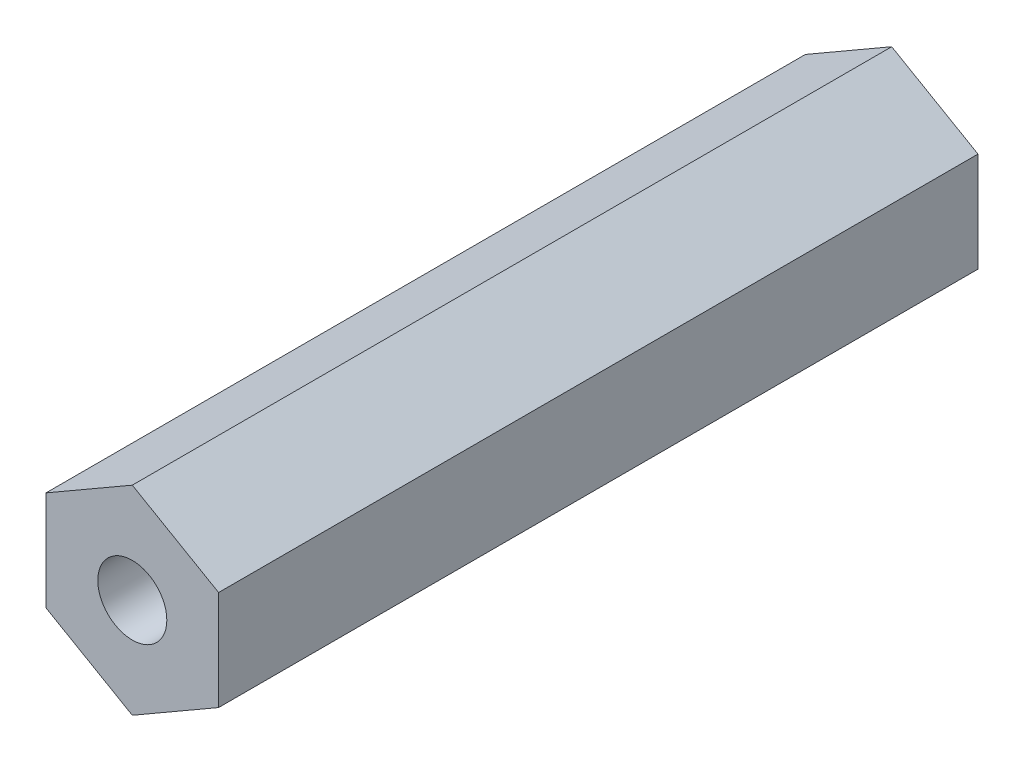
ISO-10303-21;
HEADER;
FILE_DESCRIPTION(('STEP AP214'),'2;1');
FILE_NAME('part.step','',(''),(''),'','','');
FILE_SCHEMA(('AUTOMOTIVE_DESIGN { 1 0 10303 214 1 1 1 1 }'));
ENDSEC;
DATA;
#1=APPLICATION_CONTEXT('core data for automotive mechanical design processes');
#2=APPLICATION_PROTOCOL_DEFINITION('international standard','automotive_design',2000,#1);
#3=PRODUCT_CONTEXT('',#1,'mechanical');
#4=PRODUCT('Part','Part','',(#3));
#5=PRODUCT_RELATED_PRODUCT_CATEGORY('part','',(#4));
#6=PRODUCT_DEFINITION_FORMATION('','',#4);
#7=PRODUCT_DEFINITION_CONTEXT('part definition',#1,'design');
#8=PRODUCT_DEFINITION('design','',#6,#7);
#9=PRODUCT_DEFINITION_SHAPE('','',#8);
#10=(LENGTH_UNIT() NAMED_UNIT(*) SI_UNIT(.MILLI.,.METRE.));
#11=(NAMED_UNIT(*) PLANE_ANGLE_UNIT() SI_UNIT($,.RADIAN.));
#12=(NAMED_UNIT(*) SI_UNIT($,.STERADIAN.) SOLID_ANGLE_UNIT());
#13=UNCERTAINTY_MEASURE_WITH_UNIT(LENGTH_MEASURE(1.E-05),#10,'distance_accuracy_value','');
#14=(GEOMETRIC_REPRESENTATION_CONTEXT(3) GLOBAL_UNCERTAINTY_ASSIGNED_CONTEXT((#13)) GLOBAL_UNIT_ASSIGNED_CONTEXT((#10,
#11,#12)) REPRESENTATION_CONTEXT('',''));
#15=CARTESIAN_POINT('',(0.,0.,0.));
#16=DIRECTION('',(0.,0.,1.));
#17=DIRECTION('',(1.,0.,0.));
#18=AXIS2_PLACEMENT_3D('',#15,#16,#17);
#19=CARTESIAN_POINT('',(0.,0.,22.));
#20=DIRECTION('',(0.,0.,1.));
#21=DIRECTION('',(1.,0.,0.));
#22=AXIS2_PLACEMENT_3D('',#19,#20,#21);
#23=PLANE('',#22);
#24=DIRECTION('',(-0.866025403784441,0.499999999999995,0.));
#25=VECTOR('',#24,1.);
#26=CARTESIAN_POINT('',(2.49999999999998,1.44337567297409,22.));
#27=LINE('',#26,#25);
#28=CARTESIAN_POINT('',(2.49999999999998,1.44337567297409,22.));
#29=VERTEX_POINT('',#28);
#30=CARTESIAN_POINT('',(0.,2.88675134594813,22.));
#31=VERTEX_POINT('',#30);
#32=EDGE_CURVE('E150',#29,#31,#27,.T.);
#33=ORIENTED_EDGE('',*,*,#32,.T.);
#34=DIRECTION('',(-0.866025403784438,-0.500000000000001,0.));
#35=VECTOR('',#34,1.);
#36=CARTESIAN_POINT('',(0.,2.88675134594813,22.));
#37=LINE('',#36,#35);
#38=CARTESIAN_POINT('',(-2.5,1.44337567297406,22.));
#39=VERTEX_POINT('',#38);
#40=EDGE_CURVE('E98',#31,#39,#37,.T.);
#41=ORIENTED_EDGE('',*,*,#40,.T.);
#42=DIRECTION('',(0.,-1.,0.));
#43=VECTOR('',#42,1.);
#44=CARTESIAN_POINT('',(-2.5,1.44337567297406,22.));
#45=LINE('',#44,#43);
#46=CARTESIAN_POINT('',(-2.49999999999999,-1.44337567297408,22.));
#47=VERTEX_POINT('',#46);
#48=EDGE_CURVE('E111',#39,#47,#45,.T.);
#49=ORIENTED_EDGE('',*,*,#48,.T.);
#50=DIRECTION('',(0.866025403784442,-0.499999999999995,0.));
#51=VECTOR('',#50,1.);
#52=CARTESIAN_POINT('',(-2.49999999999999,-1.44337567297408,22.));
#53=LINE('',#52,#51);
#54=CARTESIAN_POINT('',(0.,-2.88675134594813,22.));
#55=VERTEX_POINT('',#54);
#56=EDGE_CURVE('E105',#47,#55,#53,.T.);
#57=ORIENTED_EDGE('',*,*,#56,.T.);
#58=DIRECTION('',(0.866025403784435,0.500000000000007,0.));
#59=VECTOR('',#58,1.);
#60=CARTESIAN_POINT('',(0.,-2.88675134594813,22.));
#61=LINE('',#60,#59);
#62=CARTESIAN_POINT('',(2.50000000000001,-1.44337567297404,22.));
#63=VERTEX_POINT('',#62);
#64=EDGE_CURVE('E109',#55,#63,#61,.T.);
#65=ORIENTED_EDGE('',*,*,#64,.T.);
#66=DIRECTION('',(0.,1.,0.));
#67=VECTOR('',#66,1.);
#68=CARTESIAN_POINT('',(2.50000000000001,-1.44337567297404,22.));
#69=LINE('',#68,#67);
#70=EDGE_CURVE('E61',#63,#29,#69,.T.);
#71=ORIENTED_EDGE('',*,*,#70,.T.);
#72=EDGE_LOOP('',(#33,#41,#49,#57,#65,#71));
#73=FACE_BOUND('',#72,.T.);
#74=CARTESIAN_POINT('',(0.,0.,22.));
#75=DIRECTION('',(0.,0.,1.));
#76=DIRECTION('',(1.,0.,0.));
#77=AXIS2_PLACEMENT_3D('',#74,#75,#76);
#78=CIRCLE('',#77,1.);
#79=CARTESIAN_POINT('',(1.,0.,22.));
#80=VERTEX_POINT('',#79);
#81=EDGE_CURVE('E138',#80,#80,#78,.T.);
#82=ORIENTED_EDGE('',*,*,#81,.F.);
#83=EDGE_LOOP('',(#82));
#84=FACE_BOUND('',#83,.T.);
#85=ADVANCED_FACE('F43',(#73,#84),#23,.T.);
#86=CARTESIAN_POINT('',(0.,0.,0.));
#87=DIRECTION('',(0.,0.,1.));
#88=DIRECTION('',(1.,0.,0.));
#89=AXIS2_PLACEMENT_3D('',#86,#87,#88);
#90=PLANE('',#89);
#91=DIRECTION('',(-0.866025403784441,0.499999999999995,0.));
#92=VECTOR('',#91,1.);
#93=CARTESIAN_POINT('',(2.49999999999998,1.44337567297409,0.));
#94=LINE('',#93,#92);
#95=CARTESIAN_POINT('',(2.49999999999998,1.44337567297409,0.));
#96=VERTEX_POINT('',#95);
#97=CARTESIAN_POINT('',(0.,2.88675134594813,0.));
#98=VERTEX_POINT('',#97);
#99=EDGE_CURVE('E133',#96,#98,#94,.T.);
#100=ORIENTED_EDGE('',*,*,#99,.F.);
#101=DIRECTION('',(0.,1.,0.));
#102=VECTOR('',#101,1.);
#103=CARTESIAN_POINT('',(2.50000000000001,-1.44337567297404,0.));
#104=LINE('',#103,#102);
#105=CARTESIAN_POINT('',(2.50000000000001,-1.44337567297404,0.));
#106=VERTEX_POINT('',#105);
#107=EDGE_CURVE('E90',#106,#96,#104,.T.);
#108=ORIENTED_EDGE('',*,*,#107,.F.);
#109=DIRECTION('',(0.866025403784435,0.500000000000007,0.));
#110=VECTOR('',#109,1.);
#111=CARTESIAN_POINT('',(0.,-2.88675134594813,0.));
#112=LINE('',#111,#110);
#113=CARTESIAN_POINT('',(0.,-2.88675134594813,0.));
#114=VERTEX_POINT('',#113);
#115=EDGE_CURVE('E84',#114,#106,#112,.T.);
#116=ORIENTED_EDGE('',*,*,#115,.F.);
#117=DIRECTION('',(0.866025403784442,-0.499999999999995,0.));
#118=VECTOR('',#117,1.);
#119=CARTESIAN_POINT('',(-2.49999999999999,-1.44337567297408,0.));
#120=LINE('',#119,#118);
#121=CARTESIAN_POINT('',(-2.49999999999999,-1.44337567297408,0.));
#122=VERTEX_POINT('',#121);
#123=EDGE_CURVE('E120',#122,#114,#120,.T.);
#124=ORIENTED_EDGE('',*,*,#123,.F.);
#125=DIRECTION('',(0.,-1.,0.));
#126=VECTOR('',#125,1.);
#127=CARTESIAN_POINT('',(-2.5,1.44337567297406,0.));
#128=LINE('',#127,#126);
#129=CARTESIAN_POINT('',(-2.5,1.44337567297406,0.));
#130=VERTEX_POINT('',#129);
#131=EDGE_CURVE('E141',#130,#122,#128,.T.);
#132=ORIENTED_EDGE('',*,*,#131,.F.);
#133=DIRECTION('',(-0.866025403784438,-0.500000000000001,0.));
#134=VECTOR('',#133,1.);
#135=CARTESIAN_POINT('',(0.,2.88675134594813,0.));
#136=LINE('',#135,#134);
#137=EDGE_CURVE('E137',#98,#130,#136,.T.);
#138=ORIENTED_EDGE('',*,*,#137,.F.);
#139=EDGE_LOOP('',(#100,#108,#116,#124,#132,#138));
#140=FACE_BOUND('',#139,.T.);
#141=CARTESIAN_POINT('',(0.,0.,0.));
#142=DIRECTION('',(0.,0.,1.));
#143=DIRECTION('',(1.,0.,0.));
#144=AXIS2_PLACEMENT_3D('',#141,#142,#143);
#145=CIRCLE('',#144,1.);
#146=CARTESIAN_POINT('',(1.,0.,0.));
#147=VERTEX_POINT('',#146);
#148=EDGE_CURVE('E265',#147,#147,#145,.T.);
#149=ORIENTED_EDGE('',*,*,#148,.T.);
#150=EDGE_LOOP('',(#149));
#151=FACE_BOUND('',#150,.T.);
#152=ADVANCED_FACE('F163',(#140,#151),#90,.F.);
#153=CARTESIAN_POINT('',(2.49999999999998,1.44337567297409,22.));
#154=DIRECTION('',(-0.499999999999995,-0.866025403784441,0.));
#155=DIRECTION('',(0.866025403784441,-0.499999999999995,0.));
#156=AXIS2_PLACEMENT_3D('',#153,#154,#155);
#157=PLANE('',#156);
#158=ORIENTED_EDGE('',*,*,#99,.T.);
#159=DIRECTION('',(0.,0.,-1.));
#160=VECTOR('',#159,1.);
#161=CARTESIAN_POINT('',(0.,2.88675134594813,22.));
#162=LINE('',#161,#160);
#163=EDGE_CURVE('E11',#31,#98,#162,.T.);
#164=ORIENTED_EDGE('',*,*,#163,.F.);
#165=ORIENTED_EDGE('',*,*,#32,.F.);
#166=DIRECTION('',(0.,0.,-1.));
#167=VECTOR('',#166,1.);
#168=CARTESIAN_POINT('',(2.49999999999998,1.44337567297409,22.));
#169=LINE('',#168,#167);
#170=EDGE_CURVE('E129',#29,#96,#169,.T.);
#171=ORIENTED_EDGE('',*,*,#170,.T.);
#172=EDGE_LOOP('',(#158,#164,#165,#171));
#173=FACE_BOUND('',#172,.T.);
#174=ADVANCED_FACE('F45',(#173),#157,.F.);
#175=CARTESIAN_POINT('',(0.,2.88675134594813,22.));
#176=DIRECTION('',(0.500000000000001,-0.866025403784438,0.));
#177=DIRECTION('',(0.866025403784438,0.500000000000001,0.));
#178=AXIS2_PLACEMENT_3D('',#175,#176,#177);
#179=PLANE('',#178);
#180=ORIENTED_EDGE('',*,*,#137,.T.);
#181=DIRECTION('',(0.,0.,-1.));
#182=VECTOR('',#181,1.);
#183=CARTESIAN_POINT('',(-2.5,1.44337567297406,22.));
#184=LINE('',#183,#182);
#185=EDGE_CURVE('E53',#39,#130,#184,.T.);
#186=ORIENTED_EDGE('',*,*,#185,.F.);
#187=ORIENTED_EDGE('',*,*,#40,.F.);
#188=ORIENTED_EDGE('',*,*,#163,.T.);
#189=EDGE_LOOP('',(#180,#186,#187,#188));
#190=FACE_BOUND('',#189,.T.);
#191=ADVANCED_FACE('F188',(#190),#179,.F.);
#192=CARTESIAN_POINT('',(-2.5,1.44337567297406,22.));
#193=DIRECTION('',(1.,0.,0.));
#194=DIRECTION('',(0.,1.,0.));
#195=AXIS2_PLACEMENT_3D('',#192,#193,#194);
#196=PLANE('',#195);
#197=ORIENTED_EDGE('',*,*,#131,.T.);
#198=DIRECTION('',(0.,0.,-1.));
#199=VECTOR('',#198,1.);
#200=CARTESIAN_POINT('',(-2.49999999999999,-1.44337567297408,22.));
#201=LINE('',#200,#199);
#202=EDGE_CURVE('E122',#47,#122,#201,.T.);
#203=ORIENTED_EDGE('',*,*,#202,.F.);
#204=ORIENTED_EDGE('',*,*,#48,.F.);
#205=ORIENTED_EDGE('',*,*,#185,.T.);
#206=EDGE_LOOP('',(#197,#203,#204,#205));
#207=FACE_BOUND('',#206,.T.);
#208=ADVANCED_FACE('F160',(#207),#196,.F.);
#209=CARTESIAN_POINT('',(-2.49999999999999,-1.44337567297408,22.));
#210=DIRECTION('',(0.499999999999995,0.866025403784441,0.));
#211=DIRECTION('',(-0.866025403784441,0.499999999999995,0.));
#212=AXIS2_PLACEMENT_3D('',#209,#210,#211);
#213=PLANE('',#212);
#214=ORIENTED_EDGE('',*,*,#123,.T.);
#215=DIRECTION('',(0.,0.,-1.));
#216=VECTOR('',#215,1.);
#217=CARTESIAN_POINT('',(0.,-2.88675134594813,22.));
#218=LINE('',#217,#216);
#219=EDGE_CURVE('E117',#55,#114,#218,.T.);
#220=ORIENTED_EDGE('',*,*,#219,.F.);
#221=ORIENTED_EDGE('',*,*,#56,.F.);
#222=ORIENTED_EDGE('',*,*,#202,.T.);
#223=EDGE_LOOP('',(#214,#220,#221,#222));
#224=FACE_BOUND('',#223,.T.);
#225=ADVANCED_FACE('F118',(#224),#213,.F.);
#226=CARTESIAN_POINT('',(0.,-2.88675134594813,22.));
#227=DIRECTION('',(-0.500000000000007,0.866025403784435,0.));
#228=DIRECTION('',(-0.866025403784435,-0.500000000000007,0.));
#229=AXIS2_PLACEMENT_3D('',#226,#227,#228);
#230=PLANE('',#229);
#231=ORIENTED_EDGE('',*,*,#115,.T.);
#232=DIRECTION('',(0.,0.,-1.));
#233=VECTOR('',#232,1.);
#234=CARTESIAN_POINT('',(2.50000000000001,-1.44337567297404,22.));
#235=LINE('',#234,#233);
#236=EDGE_CURVE('E123',#63,#106,#235,.T.);
#237=ORIENTED_EDGE('',*,*,#236,.F.);
#238=ORIENTED_EDGE('',*,*,#64,.F.);
#239=ORIENTED_EDGE('',*,*,#219,.T.);
#240=EDGE_LOOP('',(#231,#237,#238,#239));
#241=FACE_BOUND('',#240,.T.);
#242=ADVANCED_FACE('F125',(#241),#230,.F.);
#243=CARTESIAN_POINT('',(2.50000000000001,-1.44337567297404,22.));
#244=DIRECTION('',(-1.,0.,0.));
#245=DIRECTION('',(0.,-1.,0.));
#246=AXIS2_PLACEMENT_3D('',#243,#244,#245);
#247=PLANE('',#246);
#248=ORIENTED_EDGE('',*,*,#107,.T.);
#249=ORIENTED_EDGE('',*,*,#170,.F.);
#250=ORIENTED_EDGE('',*,*,#70,.F.);
#251=ORIENTED_EDGE('',*,*,#236,.T.);
#252=EDGE_LOOP('',(#248,#249,#250,#251));
#253=FACE_BOUND('',#252,.T.);
#254=ADVANCED_FACE('F168',(#253),#247,.F.);
#255=CARTESIAN_POINT('',(0.,0.,22.));
#256=DIRECTION('',(0.,0.,-1.));
#257=DIRECTION('',(-1.,0.,0.));
#258=AXIS2_PLACEMENT_3D('',#255,#256,#257);
#259=CYLINDRICAL_SURFACE('',#258,1.);
#260=ORIENTED_EDGE('',*,*,#81,.T.);
#261=EDGE_LOOP('',(#260));
#262=FACE_BOUND('',#261,.T.);
#263=ORIENTED_EDGE('',*,*,#148,.F.);
#264=EDGE_LOOP('',(#263));
#265=FACE_BOUND('',#264,.T.);
#266=ADVANCED_FACE('F170',(#262,#265),#259,.F.);
#267=CLOSED_SHELL('',(#85,#152,#174,#191,#208,#225,#242,#254,#266));
#268=MANIFOLD_SOLID_BREP('B2',#267);
#269=ADVANCED_BREP_SHAPE_REPRESENTATION('',(#18,#268),#14);
#270=SHAPE_DEFINITION_REPRESENTATION(#9,#269);
ENDSEC;
END-ISO-10303-21;
